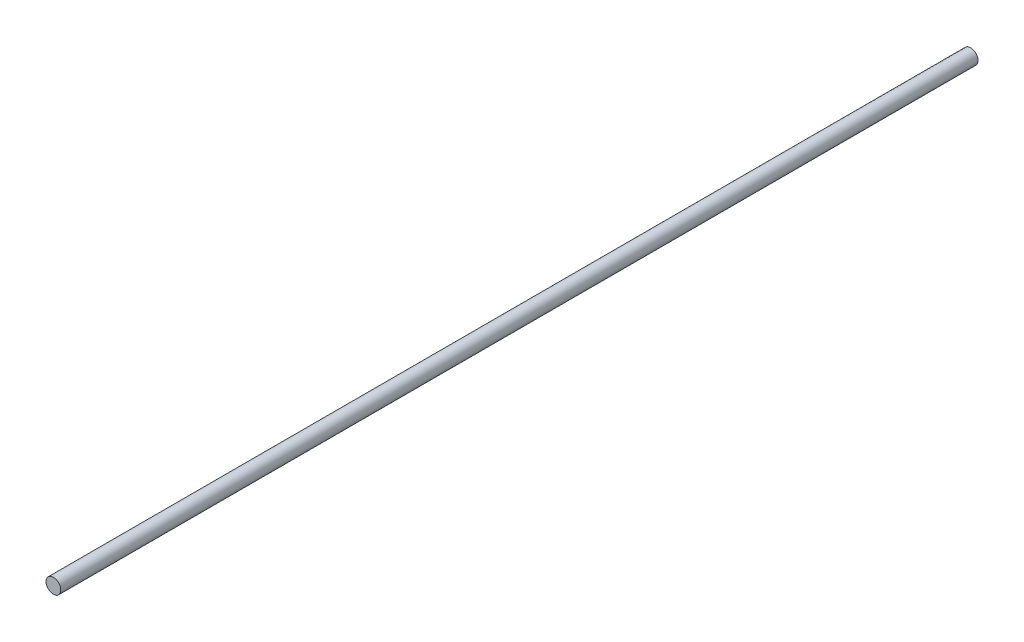
ISO-10303-21;
HEADER;
FILE_DESCRIPTION(('STEP AP214'),'2;1');
FILE_NAME('part.step','',(''),(''),'','','');
FILE_SCHEMA(('AUTOMOTIVE_DESIGN { 1 0 10303 214 1 1 1 1 }'));
ENDSEC;
DATA;
#1=APPLICATION_CONTEXT('core data for automotive mechanical design processes');
#2=APPLICATION_PROTOCOL_DEFINITION('international standard','automotive_design',2000,#1);
#3=PRODUCT_CONTEXT('',#1,'mechanical');
#4=PRODUCT('Part','Part','',(#3));
#5=PRODUCT_RELATED_PRODUCT_CATEGORY('part','',(#4));
#6=PRODUCT_DEFINITION_FORMATION('','',#4);
#7=PRODUCT_DEFINITION_CONTEXT('part definition',#1,'design');
#8=PRODUCT_DEFINITION('design','',#6,#7);
#9=PRODUCT_DEFINITION_SHAPE('','',#8);
#10=(LENGTH_UNIT() NAMED_UNIT(*) SI_UNIT(.MILLI.,.METRE.));
#11=(NAMED_UNIT(*) PLANE_ANGLE_UNIT() SI_UNIT($,.RADIAN.));
#12=(NAMED_UNIT(*) SI_UNIT($,.STERADIAN.) SOLID_ANGLE_UNIT());
#13=UNCERTAINTY_MEASURE_WITH_UNIT(LENGTH_MEASURE(1.E-05),#10,'distance_accuracy_value','');
#14=(GEOMETRIC_REPRESENTATION_CONTEXT(3) GLOBAL_UNCERTAINTY_ASSIGNED_CONTEXT((#13)) GLOBAL_UNIT_ASSIGNED_CONTEXT((#10,
#11,#12)) REPRESENTATION_CONTEXT('',''));
#15=CARTESIAN_POINT('',(0.,0.,0.));
#16=DIRECTION('',(0.,0.,1.));
#17=DIRECTION('',(1.,0.,0.));
#18=AXIS2_PLACEMENT_3D('',#15,#16,#17);
#19=CARTESIAN_POINT('',(0.,0.,248.772918341205));
#20=DIRECTION('',(0.,0.,-1.));
#21=DIRECTION('',(-1.,0.,0.));
#22=AXIS2_PLACEMENT_3D('',#19,#20,#21);
#23=CYLINDRICAL_SURFACE('',#22,2.);
#24=CARTESIAN_POINT('',(0.,0.,248.772918341205));
#25=DIRECTION('',(0.,0.,1.));
#26=DIRECTION('',(1.,0.,0.));
#27=AXIS2_PLACEMENT_3D('',#24,#25,#26);
#28=CIRCLE('',#27,2.);
#29=CARTESIAN_POINT('',(-2.,0.,248.772918341205));
#30=VERTEX_POINT('',#29);
#31=EDGE_CURVE('E10',#30,#30,#28,.T.);
#32=CARTESIAN_POINT('',(0.,0.,0.));
#33=DIRECTION('',(0.,0.,1.));
#34=DIRECTION('',(1.,0.,0.));
#35=AXIS2_PLACEMENT_3D('',#32,#33,#34);
#36=CIRCLE('',#35,2.);
#37=CARTESIAN_POINT('',(-2.,0.,0.));
#38=VERTEX_POINT('',#37);
#39=EDGE_CURVE('E40',#38,#38,#36,.T.);
#40=CARTESIAN_POINT('',(-2.,0.,248.772918341205));
#41=CARTESIAN_POINT('',(-2.,0.,246.181533775151));
#42=CARTESIAN_POINT('',(-2.,0.,243.590149209097));
#43=CARTESIAN_POINT('',(-2.,0.,238.407380076988));
#44=CARTESIAN_POINT('',(-2.,0.,235.815995510934));
#45=CARTESIAN_POINT('',(-2.,0.,230.633226378826));
#46=CARTESIAN_POINT('',(-2.,0.,228.041841812772));
#47=CARTESIAN_POINT('',(-2.,0.,222.859072680663));
#48=CARTESIAN_POINT('',(-2.,0.,220.267688114609));
#49=CARTESIAN_POINT('',(-2.,0.,215.0849189825));
#50=CARTESIAN_POINT('',(-2.,0.,212.493534416446));
#51=CARTESIAN_POINT('',(-2.,0.,207.310765284338));
#52=CARTESIAN_POINT('',(-2.,0.,204.719380718284));
#53=CARTESIAN_POINT('',(-2.,0.,199.536611586175));
#54=CARTESIAN_POINT('',(-2.,0.,196.945227020121));
#55=CARTESIAN_POINT('',(-2.,0.,191.762457888012));
#56=CARTESIAN_POINT('',(-2.,0.,189.171073321958));
#57=CARTESIAN_POINT('',(-2.,0.,183.98830418985));
#58=CARTESIAN_POINT('',(-2.,0.,181.396919623796));
#59=CARTESIAN_POINT('',(-2.,0.,176.214150491687));
#60=CARTESIAN_POINT('',(-2.,0.,173.622765925633));
#61=CARTESIAN_POINT('',(-2.,0.,168.439996793524));
#62=CARTESIAN_POINT('',(-2.,0.,165.84861222747));
#63=CARTESIAN_POINT('',(-2.,0.,160.665843095362));
#64=CARTESIAN_POINT('',(-2.,0.,158.074458529308));
#65=CARTESIAN_POINT('',(-2.,0.,152.891689397199));
#66=CARTESIAN_POINT('',(-2.,0.,150.300304831145));
#67=CARTESIAN_POINT('',(-2.,0.,145.117535699036));
#68=CARTESIAN_POINT('',(-2.,0.,142.526151132982));
#69=CARTESIAN_POINT('',(-2.,0.,137.343382000874));
#70=CARTESIAN_POINT('',(-2.,0.,134.75199743482));
#71=CARTESIAN_POINT('',(-2.,0.,129.569228302711));
#72=CARTESIAN_POINT('',(-2.,0.,126.977843736657));
#73=CARTESIAN_POINT('',(-2.,0.,121.795074604548));
#74=CARTESIAN_POINT('',(-2.,0.,119.203690038494));
#75=CARTESIAN_POINT('',(-2.,0.,114.020920906386));
#76=CARTESIAN_POINT('',(-2.,0.,111.429536340332));
#77=CARTESIAN_POINT('',(-2.,0.,106.246767208223));
#78=CARTESIAN_POINT('',(-2.,0.,103.655382642169));
#79=CARTESIAN_POINT('',(-2.,0.,98.4726135100604));
#80=CARTESIAN_POINT('',(-2.,0.,95.8812289440062));
#81=CARTESIAN_POINT('',(-2.,0.,90.6984598118977));
#82=CARTESIAN_POINT('',(-2.,0.,88.1070752458435));
#83=CARTESIAN_POINT('',(-2.,0.,82.9243061137351));
#84=CARTESIAN_POINT('',(-2.,0.,80.3329215476809));
#85=CARTESIAN_POINT('',(-2.,0.,75.1501524155724));
#86=CARTESIAN_POINT('',(-2.,0.,72.5587678495182));
#87=CARTESIAN_POINT('',(-2.,0.,67.3759987174097));
#88=CARTESIAN_POINT('',(-2.,0.,64.7846141513555));
#89=CARTESIAN_POINT('',(-2.,0.,59.6018450192471));
#90=CARTESIAN_POINT('',(-2.,0.,57.0104604531928));
#91=CARTESIAN_POINT('',(-2.,0.,51.8276913210844));
#92=CARTESIAN_POINT('',(-2.,0.,49.2363067550302));
#93=CARTESIAN_POINT('',(-2.,0.,44.0535376229218));
#94=CARTESIAN_POINT('',(-2.,0.,41.4621530568675));
#95=CARTESIAN_POINT('',(-2.,0.,36.2793839247591));
#96=CARTESIAN_POINT('',(-2.,0.,33.6879993587049));
#97=CARTESIAN_POINT('',(-2.,0.,28.5052302265964));
#98=CARTESIAN_POINT('',(-2.,0.,25.9138456605422));
#99=CARTESIAN_POINT('',(-2.,0.,20.7310765284337));
#100=CARTESIAN_POINT('',(-2.,0.,18.1396919623795));
#101=CARTESIAN_POINT('',(-2.,0.,12.9569228302711));
#102=CARTESIAN_POINT('',(-2.,0.,10.3655382642169));
#103=CARTESIAN_POINT('',(-2.,0.,5.18276913210842));
#104=CARTESIAN_POINT('',(-2.,0.,2.5913845660542));
#105=CARTESIAN_POINT('',(-2.,0.,0.));
#106=B_SPLINE_CURVE_WITH_KNOTS('',3,(#40,#41,#42,#43,#44,#45,#46,#47,#48,#49,#50,#51,#52,#53,
#54,#55,#56,#57,#58,#59,#60,#61,#62,#63,#64,#65,#66,#67,#68,#69,#70,#71,#72,#73,#74,#75,#76,#77,
#78,#79,#80,#81,#82,#83,#84,#85,#86,#87,#88,#89,#90,#91,#92,#93,#94,#95,#96,#97,#98,#99,#100,
#101,#102,#103,#104,#105),.UNSPECIFIED.,.F.,.F.,(4,2,2,2,2,2,2,2,2,2,2,2,2,2,2,2,2,2,2,2,2,2,2,
2,2,2,2,2,2,2,2,2,4),(0.,7.77415369816264,15.5483073963253,23.322461094488,31.0966147926507,
38.8707684908133,46.644922188976,54.4190758871387,62.1932295853013,69.967383283464,
77.7415369816266,85.5156906797893,93.289844377952,101.063998076115,108.838151774277,
116.61230547244,124.386459170603,132.160612868765,139.934766566928,147.708920265091,
155.483073963253,163.257227661416,171.031381359579,178.805535057741,186.579688755904,
194.353842454067,202.127996152229,209.902149850392,217.676303548555,225.450457246717,
233.22461094488,240.998764643043,248.772918341205),.UNSPECIFIED.);
#107=EDGE_CURVE('BSEAM37',#30,#38,#106,.T.);
#108=ORIENTED_EDGE('',*,*,#31,.F.);
#109=ORIENTED_EDGE('',*,*,#39,.T.);
#110=ORIENTED_EDGE('',*,*,#107,.T.);
#111=ORIENTED_EDGE('',*,*,#107,.F.);
#112=EDGE_LOOP('',(#108,#110,#109,#111));
#113=FACE_BOUND('',#112,.T.);
#114=ADVANCED_FACE('F37',(#113),#23,.T.);
#115=CARTESIAN_POINT('',(0.,0.,248.772918341205));
#116=DIRECTION('',(0.,0.,1.));
#117=DIRECTION('',(1.,0.,0.));
#118=AXIS2_PLACEMENT_3D('',#115,#116,#117);
#119=PLANE('',#118);
#120=ORIENTED_EDGE('',*,*,#31,.T.);
#121=EDGE_LOOP('',(#120));
#122=FACE_BOUND('',#121,.T.);
#123=ADVANCED_FACE('F52',(#122),#119,.T.);
#124=CARTESIAN_POINT('',(0.,0.,0.));
#125=DIRECTION('',(0.,0.,1.));
#126=DIRECTION('',(1.,0.,0.));
#127=AXIS2_PLACEMENT_3D('',#124,#125,#126);
#128=PLANE('',#127);
#129=ORIENTED_EDGE('',*,*,#39,.F.);
#130=EDGE_LOOP('',(#129));
#131=FACE_BOUND('',#130,.T.);
#132=ADVANCED_FACE('F50',(#131),#128,.F.);
#133=CLOSED_SHELL('',(#114,#123,#132));
#134=MANIFOLD_SOLID_BREP('B2',#133);
#135=ADVANCED_BREP_SHAPE_REPRESENTATION('',(#18,#134),#14);
#136=SHAPE_DEFINITION_REPRESENTATION(#9,#135);
ENDSEC;
END-ISO-10303-21;
